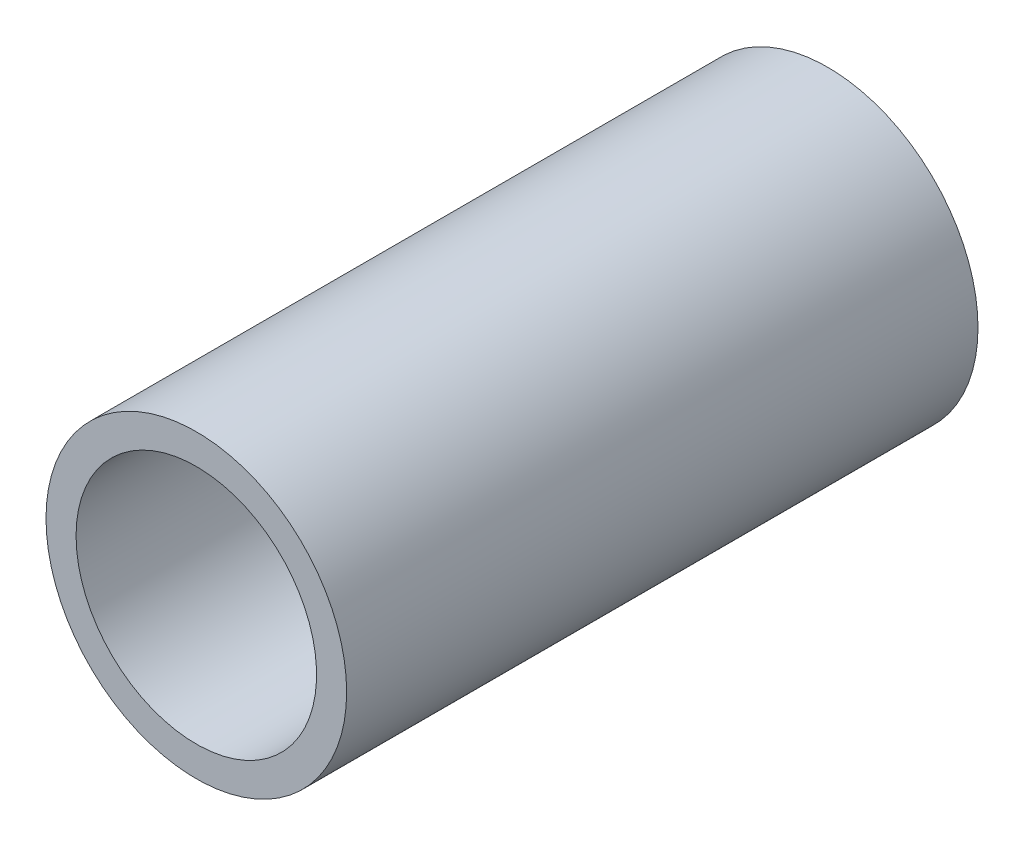
ISO-10303-21;
HEADER;
FILE_DESCRIPTION(('STEP AP214'),'2;1');
FILE_NAME('part.step','',(''),(''),'','','');
FILE_SCHEMA(('AUTOMOTIVE_DESIGN { 1 0 10303 214 1 1 1 1 }'));
ENDSEC;
DATA;
#1=APPLICATION_CONTEXT('core data for automotive mechanical design processes');
#2=APPLICATION_PROTOCOL_DEFINITION('international standard','automotive_design',2000,#1);
#3=PRODUCT_CONTEXT('',#1,'mechanical');
#4=PRODUCT('Part','Part','',(#3));
#5=PRODUCT_RELATED_PRODUCT_CATEGORY('part','',(#4));
#6=PRODUCT_DEFINITION_FORMATION('','',#4);
#7=PRODUCT_DEFINITION_CONTEXT('part definition',#1,'design');
#8=PRODUCT_DEFINITION('design','',#6,#7);
#9=PRODUCT_DEFINITION_SHAPE('','',#8);
#10=(LENGTH_UNIT() NAMED_UNIT(*) SI_UNIT(.MILLI.,.METRE.));
#11=(NAMED_UNIT(*) PLANE_ANGLE_UNIT() SI_UNIT($,.RADIAN.));
#12=(NAMED_UNIT(*) SI_UNIT($,.STERADIAN.) SOLID_ANGLE_UNIT());
#13=UNCERTAINTY_MEASURE_WITH_UNIT(LENGTH_MEASURE(1.E-05),#10,'distance_accuracy_value','');
#14=(GEOMETRIC_REPRESENTATION_CONTEXT(3) GLOBAL_UNCERTAINTY_ASSIGNED_CONTEXT((#13)) GLOBAL_UNIT_ASSIGNED_CONTEXT((#10,
#11,#12)) REPRESENTATION_CONTEXT('',''));
#15=CARTESIAN_POINT('',(0.,0.,0.));
#16=DIRECTION('',(0.,0.,1.));
#17=DIRECTION('',(1.,0.,0.));
#18=AXIS2_PLACEMENT_3D('',#15,#16,#17);
#19=CARTESIAN_POINT('',(0.,0.,21.));
#20=DIRECTION('',(0.,0.,1.));
#21=DIRECTION('',(1.,0.,0.));
#22=AXIS2_PLACEMENT_3D('',#19,#20,#21);
#23=PLANE('',#22);
#24=CARTESIAN_POINT('',(0.,0.,21.));
#25=DIRECTION('',(0.,0.,1.));
#26=DIRECTION('',(1.,0.,0.));
#27=AXIS2_PLACEMENT_3D('',#24,#25,#26);
#28=CIRCLE('',#27,5.);
#29=CARTESIAN_POINT('',(-5.,0.,21.));
#30=VERTEX_POINT('',#29);
#31=EDGE_CURVE('E10',#30,#30,#28,.T.);
#32=ORIENTED_EDGE('',*,*,#31,.T.);
#33=EDGE_LOOP('',(#32));
#34=FACE_BOUND('',#33,.T.);
#35=CARTESIAN_POINT('',(0.,0.,21.));
#36=DIRECTION('',(0.,0.,1.));
#37=DIRECTION('',(1.,0.,0.));
#38=AXIS2_PLACEMENT_3D('',#35,#36,#37);
#39=CIRCLE('',#38,4.);
#40=CARTESIAN_POINT('',(-4.,0.,21.));
#41=VERTEX_POINT('',#40);
#42=EDGE_CURVE('E43',#41,#41,#39,.T.);
#43=ORIENTED_EDGE('',*,*,#42,.F.);
#44=EDGE_LOOP('',(#43));
#45=FACE_BOUND('',#44,.T.);
#46=ADVANCED_FACE('F32',(#34,#45),#23,.T.);
#47=CARTESIAN_POINT('',(0.,0.,0.));
#48=DIRECTION('',(0.,0.,1.));
#49=DIRECTION('',(1.,0.,0.));
#50=AXIS2_PLACEMENT_3D('',#47,#48,#49);
#51=PLANE('',#50);
#52=CARTESIAN_POINT('',(0.,0.,0.));
#53=DIRECTION('',(0.,0.,1.));
#54=DIRECTION('',(1.,0.,0.));
#55=AXIS2_PLACEMENT_3D('',#52,#53,#54);
#56=CIRCLE('',#55,5.);
#57=CARTESIAN_POINT('',(-5.,0.,0.));
#58=VERTEX_POINT('',#57);
#59=EDGE_CURVE('E36',#58,#58,#56,.T.);
#60=ORIENTED_EDGE('',*,*,#59,.F.);
#61=EDGE_LOOP('',(#60));
#62=FACE_BOUND('',#61,.T.);
#63=CARTESIAN_POINT('',(0.,0.,0.));
#64=DIRECTION('',(0.,0.,1.));
#65=DIRECTION('',(1.,0.,0.));
#66=AXIS2_PLACEMENT_3D('',#63,#64,#65);
#67=CIRCLE('',#66,4.);
#68=CARTESIAN_POINT('',(-4.,0.,0.));
#69=VERTEX_POINT('',#68);
#70=EDGE_CURVE('E45',#69,#69,#67,.T.);
#71=ORIENTED_EDGE('',*,*,#70,.T.);
#72=EDGE_LOOP('',(#71));
#73=FACE_BOUND('',#72,.T.);
#74=ADVANCED_FACE('F55',(#62,#73),#51,.F.);
#75=CARTESIAN_POINT('',(0.,0.,21.));
#76=DIRECTION('',(0.,0.,-1.));
#77=DIRECTION('',(-1.,0.,0.));
#78=AXIS2_PLACEMENT_3D('',#75,#76,#77);
#79=CYLINDRICAL_SURFACE('',#78,5.);
#80=CARTESIAN_POINT('',(-5.,0.,21.));
#81=CARTESIAN_POINT('',(-5.,0.,20.78125));
#82=CARTESIAN_POINT('',(-5.,0.,20.5625));
#83=CARTESIAN_POINT('',(-5.,0.,20.125));
#84=CARTESIAN_POINT('',(-5.,0.,19.90625));
#85=CARTESIAN_POINT('',(-5.,0.,19.46875));
#86=CARTESIAN_POINT('',(-5.,0.,19.25));
#87=CARTESIAN_POINT('',(-5.,0.,18.8125));
#88=CARTESIAN_POINT('',(-5.,0.,18.59375));
#89=CARTESIAN_POINT('',(-5.,0.,18.15625));
#90=CARTESIAN_POINT('',(-5.,0.,17.9375));
#91=CARTESIAN_POINT('',(-5.,0.,17.5));
#92=CARTESIAN_POINT('',(-5.,0.,17.28125));
#93=CARTESIAN_POINT('',(-5.,0.,16.84375));
#94=CARTESIAN_POINT('',(-5.,0.,16.625));
#95=CARTESIAN_POINT('',(-5.,0.,16.1875));
#96=CARTESIAN_POINT('',(-5.,0.,15.96875));
#97=CARTESIAN_POINT('',(-5.,0.,15.53125));
#98=CARTESIAN_POINT('',(-5.,0.,15.3125));
#99=CARTESIAN_POINT('',(-5.,0.,14.875));
#100=CARTESIAN_POINT('',(-5.,0.,14.65625));
#101=CARTESIAN_POINT('',(-5.,0.,14.21875));
#102=CARTESIAN_POINT('',(-5.,0.,14.));
#103=CARTESIAN_POINT('',(-5.,0.,13.5625));
#104=CARTESIAN_POINT('',(-5.,0.,13.34375));
#105=CARTESIAN_POINT('',(-5.,0.,12.90625));
#106=CARTESIAN_POINT('',(-5.,0.,12.6875));
#107=CARTESIAN_POINT('',(-5.,0.,12.25));
#108=CARTESIAN_POINT('',(-5.,0.,12.03125));
#109=CARTESIAN_POINT('',(-5.,0.,11.59375));
#110=CARTESIAN_POINT('',(-5.,0.,11.375));
#111=CARTESIAN_POINT('',(-5.,0.,10.9375));
#112=CARTESIAN_POINT('',(-5.,0.,10.71875));
#113=CARTESIAN_POINT('',(-5.,0.,10.28125));
#114=CARTESIAN_POINT('',(-5.,0.,10.0625));
#115=CARTESIAN_POINT('',(-5.,0.,9.625));
#116=CARTESIAN_POINT('',(-5.,0.,9.40625));
#117=CARTESIAN_POINT('',(-5.,0.,8.96875));
#118=CARTESIAN_POINT('',(-5.,0.,8.75));
#119=CARTESIAN_POINT('',(-5.,0.,8.3125));
#120=CARTESIAN_POINT('',(-5.,0.,8.09375));
#121=CARTESIAN_POINT('',(-5.,0.,7.65625));
#122=CARTESIAN_POINT('',(-5.,0.,7.4375));
#123=CARTESIAN_POINT('',(-5.,0.,7.));
#124=CARTESIAN_POINT('',(-5.,0.,6.78125));
#125=CARTESIAN_POINT('',(-5.,0.,6.34375));
#126=CARTESIAN_POINT('',(-5.,0.,6.125));
#127=CARTESIAN_POINT('',(-5.,0.,5.6875));
#128=CARTESIAN_POINT('',(-5.,0.,5.46875));
#129=CARTESIAN_POINT('',(-5.,0.,5.03125));
#130=CARTESIAN_POINT('',(-5.,0.,4.8125));
#131=CARTESIAN_POINT('',(-5.,0.,4.375));
#132=CARTESIAN_POINT('',(-5.,0.,4.15625));
#133=CARTESIAN_POINT('',(-5.,0.,3.71875));
#134=CARTESIAN_POINT('',(-5.,0.,3.5));
#135=CARTESIAN_POINT('',(-5.,0.,3.0625));
#136=CARTESIAN_POINT('',(-5.,0.,2.84375));
#137=CARTESIAN_POINT('',(-5.,0.,2.40625));
#138=CARTESIAN_POINT('',(-5.,0.,2.1875));
#139=CARTESIAN_POINT('',(-5.,0.,1.75));
#140=CARTESIAN_POINT('',(-5.,0.,1.53125));
#141=CARTESIAN_POINT('',(-5.,0.,1.09375));
#142=CARTESIAN_POINT('',(-5.,0.,0.875000000000001));
#143=CARTESIAN_POINT('',(-5.,0.,0.4375));
#144=CARTESIAN_POINT('',(-5.,0.,0.21875));
#145=CARTESIAN_POINT('',(-5.,0.,0.));
#146=B_SPLINE_CURVE_WITH_KNOTS('',3,(#80,#81,#82,#83,#84,#85,#86,#87,#88,#89,#90,#91,#92,#93,
#94,#95,#96,#97,#98,#99,#100,#101,#102,#103,#104,#105,#106,#107,#108,#109,#110,#111,#112,#113,
#114,#115,#116,#117,#118,#119,#120,#121,#122,#123,#124,#125,#126,#127,#128,#129,#130,#131,#132,
#133,#134,#135,#136,#137,#138,#139,#140,#141,#142,#143,#144,#145),.UNSPECIFIED.,.F.,.F.,(4,2,2,
2,2,2,2,2,2,2,2,2,2,2,2,2,2,2,2,2,2,2,2,2,2,2,2,2,2,2,2,2,4),(0.,0.656250000000001,1.3125,
1.96875,2.625,3.28125,3.9375,4.59375,5.25,5.90625,6.5625,7.21875,7.875,8.53125,9.1875,9.84375,
10.5,11.15625,11.8125,12.46875,13.125,13.78125,14.4375,15.09375,15.75,16.40625,17.0625,17.71875,
18.375,19.03125,19.6875,20.34375,21.),.UNSPECIFIED.);
#147=EDGE_CURVE('BSEAM34',#30,#58,#146,.T.);
#148=ORIENTED_EDGE('',*,*,#31,.F.);
#149=ORIENTED_EDGE('',*,*,#59,.T.);
#150=ORIENTED_EDGE('',*,*,#147,.T.);
#151=ORIENTED_EDGE('',*,*,#147,.F.);
#152=EDGE_LOOP('',(#148,#150,#149,#151));
#153=FACE_BOUND('',#152,.T.);
#154=ADVANCED_FACE('F34',(#153),#79,.T.);
#155=CARTESIAN_POINT('',(0.,0.,21.));
#156=DIRECTION('',(0.,0.,-1.));
#157=DIRECTION('',(-1.,0.,0.));
#158=AXIS2_PLACEMENT_3D('',#155,#156,#157);
#159=CYLINDRICAL_SURFACE('',#158,4.);
#160=CARTESIAN_POINT('',(-4.,0.,21.));
#161=CARTESIAN_POINT('',(-4.,0.,20.78125));
#162=CARTESIAN_POINT('',(-4.,0.,20.5625));
#163=CARTESIAN_POINT('',(-4.,0.,20.125));
#164=CARTESIAN_POINT('',(-4.,0.,19.90625));
#165=CARTESIAN_POINT('',(-4.,0.,19.46875));
#166=CARTESIAN_POINT('',(-4.,0.,19.25));
#167=CARTESIAN_POINT('',(-4.,0.,18.8125));
#168=CARTESIAN_POINT('',(-4.,0.,18.59375));
#169=CARTESIAN_POINT('',(-4.,0.,18.15625));
#170=CARTESIAN_POINT('',(-4.,0.,17.9375));
#171=CARTESIAN_POINT('',(-4.,0.,17.5));
#172=CARTESIAN_POINT('',(-4.,0.,17.28125));
#173=CARTESIAN_POINT('',(-4.,0.,16.84375));
#174=CARTESIAN_POINT('',(-4.,0.,16.625));
#175=CARTESIAN_POINT('',(-4.,0.,16.1875));
#176=CARTESIAN_POINT('',(-4.,0.,15.96875));
#177=CARTESIAN_POINT('',(-4.,0.,15.53125));
#178=CARTESIAN_POINT('',(-4.,0.,15.3125));
#179=CARTESIAN_POINT('',(-4.,0.,14.875));
#180=CARTESIAN_POINT('',(-4.,0.,14.65625));
#181=CARTESIAN_POINT('',(-4.,0.,14.21875));
#182=CARTESIAN_POINT('',(-4.,0.,14.));
#183=CARTESIAN_POINT('',(-4.,0.,13.5625));
#184=CARTESIAN_POINT('',(-4.,0.,13.34375));
#185=CARTESIAN_POINT('',(-4.,0.,12.90625));
#186=CARTESIAN_POINT('',(-4.,0.,12.6875));
#187=CARTESIAN_POINT('',(-4.,0.,12.25));
#188=CARTESIAN_POINT('',(-4.,0.,12.03125));
#189=CARTESIAN_POINT('',(-4.,0.,11.59375));
#190=CARTESIAN_POINT('',(-4.,0.,11.375));
#191=CARTESIAN_POINT('',(-4.,0.,10.9375));
#192=CARTESIAN_POINT('',(-4.,0.,10.71875));
#193=CARTESIAN_POINT('',(-4.,0.,10.28125));
#194=CARTESIAN_POINT('',(-4.,0.,10.0625));
#195=CARTESIAN_POINT('',(-4.,0.,9.625));
#196=CARTESIAN_POINT('',(-4.,0.,9.40625));
#197=CARTESIAN_POINT('',(-4.,0.,8.96875));
#198=CARTESIAN_POINT('',(-4.,0.,8.75));
#199=CARTESIAN_POINT('',(-4.,0.,8.3125));
#200=CARTESIAN_POINT('',(-4.,0.,8.09375));
#201=CARTESIAN_POINT('',(-4.,0.,7.65625));
#202=CARTESIAN_POINT('',(-4.,0.,7.4375));
#203=CARTESIAN_POINT('',(-4.,0.,7.));
#204=CARTESIAN_POINT('',(-4.,0.,6.78125));
#205=CARTESIAN_POINT('',(-4.,0.,6.34375));
#206=CARTESIAN_POINT('',(-4.,0.,6.125));
#207=CARTESIAN_POINT('',(-4.,0.,5.6875));
#208=CARTESIAN_POINT('',(-4.,0.,5.46875));
#209=CARTESIAN_POINT('',(-4.,0.,5.03125));
#210=CARTESIAN_POINT('',(-4.,0.,4.8125));
#211=CARTESIAN_POINT('',(-4.,0.,4.375));
#212=CARTESIAN_POINT('',(-4.,0.,4.15625));
#213=CARTESIAN_POINT('',(-4.,0.,3.71875));
#214=CARTESIAN_POINT('',(-4.,0.,3.5));
#215=CARTESIAN_POINT('',(-4.,0.,3.0625));
#216=CARTESIAN_POINT('',(-4.,0.,2.84375));
#217=CARTESIAN_POINT('',(-4.,0.,2.40625));
#218=CARTESIAN_POINT('',(-4.,0.,2.1875));
#219=CARTESIAN_POINT('',(-4.,0.,1.75));
#220=CARTESIAN_POINT('',(-4.,0.,1.53125));
#221=CARTESIAN_POINT('',(-4.,0.,1.09375));
#222=CARTESIAN_POINT('',(-4.,0.,0.875000000000001));
#223=CARTESIAN_POINT('',(-4.,0.,0.4375));
#224=CARTESIAN_POINT('',(-4.,0.,0.21875));
#225=CARTESIAN_POINT('',(-4.,0.,0.));
#226=B_SPLINE_CURVE_WITH_KNOTS('',3,(#160,#161,#162,#163,#164,#165,#166,#167,#168,#169,#170,
#171,#172,#173,#174,#175,#176,#177,#178,#179,#180,#181,#182,#183,#184,#185,#186,#187,#188,#189,
#190,#191,#192,#193,#194,#195,#196,#197,#198,#199,#200,#201,#202,#203,#204,#205,#206,#207,#208,
#209,#210,#211,#212,#213,#214,#215,#216,#217,#218,#219,#220,#221,#222,#223,#224,#225),
.UNSPECIFIED.,.F.,.F.,(4,2,2,2,2,2,2,2,2,2,2,2,2,2,2,2,2,2,2,2,2,2,2,2,2,2,2,2,2,2,2,2,4),(0.,
0.656249999999997,1.3125,1.96875,2.625,3.28125,3.9375,4.59375,5.25,5.90625,6.5625,7.21875,7.875,
8.53125,9.1875,9.84375,10.5,11.15625,11.8125,12.46875,13.125,13.78125,14.4375,15.09375,15.75,
16.40625,17.0625,17.71875,18.375,19.03125,19.6875,20.34375,21.),.UNSPECIFIED.);
#227=EDGE_CURVE('BSEAM51',#41,#69,#226,.T.);
#228=ORIENTED_EDGE('',*,*,#42,.T.);
#229=ORIENTED_EDGE('',*,*,#70,.F.);
#230=ORIENTED_EDGE('',*,*,#227,.T.);
#231=ORIENTED_EDGE('',*,*,#227,.F.);
#232=EDGE_LOOP('',(#228,#230,#229,#231));
#233=FACE_BOUND('',#232,.T.);
#234=ADVANCED_FACE('F51',(#233),#159,.F.);
#235=CLOSED_SHELL('',(#46,#74,#154,#234));
#236=MANIFOLD_SOLID_BREP('B2',#235);
#237=ADVANCED_BREP_SHAPE_REPRESENTATION('',(#18,#236),#14);
#238=SHAPE_DEFINITION_REPRESENTATION(#9,#237);
ENDSEC;
END-ISO-10303-21;
